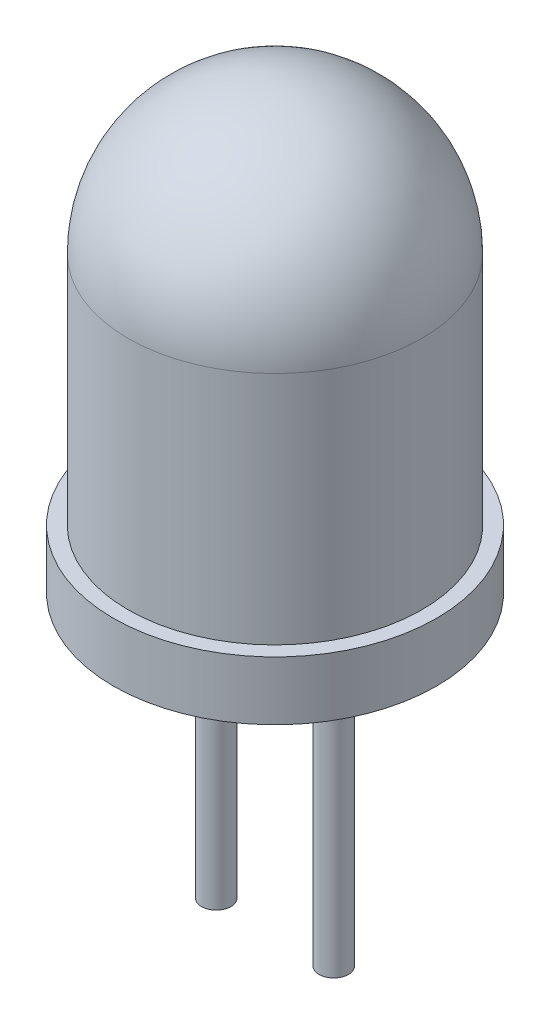
ISO-10303-21;
HEADER;
FILE_DESCRIPTION(('STEP AP214'),'2;1');
FILE_NAME('part.step','',(''),(''),'','','');
FILE_SCHEMA(('AUTOMOTIVE_DESIGN { 1 0 10303 214 1 1 1 1 }'));
ENDSEC;
DATA;
#1=APPLICATION_CONTEXT('core data for automotive mechanical design processes');
#2=APPLICATION_PROTOCOL_DEFINITION('international standard','automotive_design',2000,#1);
#3=PRODUCT_CONTEXT('',#1,'mechanical');
#4=PRODUCT('Part','Part','',(#3));
#5=PRODUCT_RELATED_PRODUCT_CATEGORY('part','',(#4));
#6=PRODUCT_DEFINITION_FORMATION('','',#4);
#7=PRODUCT_DEFINITION_CONTEXT('part definition',#1,'design');
#8=PRODUCT_DEFINITION('design','',#6,#7);
#9=PRODUCT_DEFINITION_SHAPE('','',#8);
#10=(LENGTH_UNIT() NAMED_UNIT(*) SI_UNIT(.MILLI.,.METRE.));
#11=(NAMED_UNIT(*) PLANE_ANGLE_UNIT() SI_UNIT($,.RADIAN.));
#12=(NAMED_UNIT(*) SI_UNIT($,.STERADIAN.) SOLID_ANGLE_UNIT());
#13=UNCERTAINTY_MEASURE_WITH_UNIT(LENGTH_MEASURE(1.E-05),#10,'distance_accuracy_value','');
#14=(GEOMETRIC_REPRESENTATION_CONTEXT(3) GLOBAL_UNCERTAINTY_ASSIGNED_CONTEXT((#13)) GLOBAL_UNIT_ASSIGNED_CONTEXT((#10,
#11,#12)) REPRESENTATION_CONTEXT('',''));
#15=CARTESIAN_POINT('',(0.,0.,0.));
#16=DIRECTION('',(0.,0.,1.));
#17=DIRECTION('',(1.,0.,0.));
#18=AXIS2_PLACEMENT_3D('',#15,#16,#17);
#19=CARTESIAN_POINT('',(0.,0.,0.));
#20=DIRECTION('',(0.,1.,0.));
#21=DIRECTION('',(0.,0.,1.));
#22=AXIS2_PLACEMENT_3D('',#19,#20,#21);
#23=PLANE('',#22);
#24=CARTESIAN_POINT('',(-2.,0.,0.));
#25=DIRECTION('',(0.,1.,0.));
#26=DIRECTION('',(0.,0.,1.));
#27=AXIS2_PLACEMENT_3D('',#24,#25,#26);
#28=CIRCLE('',#27,0.5);
#29=CARTESIAN_POINT('',(-2.,0.,0.5));
#30=VERTEX_POINT('',#29);
#31=EDGE_CURVE('E38',#30,#30,#28,.F.);
#32=ORIENTED_EDGE('',*,*,#31,.F.);
#33=EDGE_LOOP('',(#32));
#34=FACE_BOUND('',#33,.T.);
#35=CARTESIAN_POINT('',(0.,0.,0.));
#36=DIRECTION('',(0.,1.,0.));
#37=DIRECTION('',(0.,0.,1.));
#38=AXIS2_PLACEMENT_3D('',#35,#36,#37);
#39=CIRCLE('',#38,5.5);
#40=CARTESIAN_POINT('',(0.,0.,5.5));
#41=VERTEX_POINT('',#40);
#42=EDGE_CURVE('E46',#41,#41,#39,.T.);
#43=ORIENTED_EDGE('',*,*,#42,.F.);
#44=EDGE_LOOP('',(#43));
#45=FACE_BOUND('',#44,.T.);
#46=CARTESIAN_POINT('',(2.,0.,0.));
#47=DIRECTION('',(0.,1.,0.));
#48=DIRECTION('',(0.,0.,1.));
#49=AXIS2_PLACEMENT_3D('',#46,#47,#48);
#50=CIRCLE('',#49,0.5);
#51=CARTESIAN_POINT('',(2.,0.,0.5));
#52=VERTEX_POINT('',#51);
#53=EDGE_CURVE('E10',#52,#52,#50,.F.);
#54=ORIENTED_EDGE('',*,*,#53,.F.);
#55=EDGE_LOOP('',(#54));
#56=FACE_BOUND('',#55,.T.);
#57=ADVANCED_FACE('F31',(#34,#45,#56),#23,.F.);
#58=CARTESIAN_POINT('',(0.,2.,0.));
#59=DIRECTION('',(0.,1.,0.));
#60=DIRECTION('',(0.,0.,1.));
#61=AXIS2_PLACEMENT_3D('',#58,#59,#60);
#62=PLANE('',#61);
#63=CARTESIAN_POINT('',(0.,2.,0.));
#64=DIRECTION('',(0.,1.,0.));
#65=DIRECTION('',(0.,0.,1.));
#66=AXIS2_PLACEMENT_3D('',#63,#64,#65);
#67=CIRCLE('',#66,5.5);
#68=CARTESIAN_POINT('',(0.,2.,5.5));
#69=VERTEX_POINT('',#68);
#70=EDGE_CURVE('E42',#69,#69,#67,.T.);
#71=ORIENTED_EDGE('',*,*,#70,.T.);
#72=EDGE_LOOP('',(#71));
#73=FACE_BOUND('',#72,.T.);
#74=CARTESIAN_POINT('',(0.,2.,0.));
#75=DIRECTION('',(0.,1.,0.));
#76=DIRECTION('',(0.,0.,1.));
#77=AXIS2_PLACEMENT_3D('',#74,#75,#76);
#78=CIRCLE('',#77,5.);
#79=CARTESIAN_POINT('',(0.,2.,5.));
#80=VERTEX_POINT('',#79);
#81=EDGE_CURVE('E52',#80,#80,#78,.T.);
#82=ORIENTED_EDGE('',*,*,#81,.F.);
#83=EDGE_LOOP('',(#82));
#84=FACE_BOUND('',#83,.T.);
#85=ADVANCED_FACE('F79',(#73,#84),#62,.T.);
#86=CARTESIAN_POINT('',(0.,2.,0.));
#87=DIRECTION('',(0.,-1.,0.));
#88=DIRECTION('',(0.,0.,-1.));
#89=AXIS2_PLACEMENT_3D('',#86,#87,#88);
#90=CYLINDRICAL_SURFACE('',#89,5.5);
#91=ORIENTED_EDGE('',*,*,#70,.F.);
#92=EDGE_LOOP('',(#91));
#93=FACE_BOUND('',#92,.T.);
#94=ORIENTED_EDGE('',*,*,#42,.T.);
#95=EDGE_LOOP('',(#94));
#96=FACE_BOUND('',#95,.T.);
#97=ADVANCED_FACE('F85',(#93,#96),#90,.T.);
#98=CARTESIAN_POINT('',(0.,10.,0.));
#99=DIRECTION('',(0.,-1.,0.));
#100=DIRECTION('',(0.,0.,-1.));
#101=AXIS2_PLACEMENT_3D('',#98,#99,#100);
#102=CYLINDRICAL_SURFACE('',#101,5.);
#103=CARTESIAN_POINT('',(0.,10.,0.));
#104=DIRECTION('',(0.,1.,0.));
#105=DIRECTION('',(0.,0.,1.));
#106=AXIS2_PLACEMENT_3D('',#103,#104,#105);
#107=CIRCLE('',#106,5.);
#108=CARTESIAN_POINT('',(0.,10.,5.));
#109=VERTEX_POINT('',#108);
#110=EDGE_CURVE('E49',#109,#109,#107,.T.);
#111=ORIENTED_EDGE('',*,*,#110,.F.);
#112=EDGE_LOOP('',(#111));
#113=FACE_BOUND('',#112,.T.);
#114=ORIENTED_EDGE('',*,*,#81,.T.);
#115=EDGE_LOOP('',(#114));
#116=FACE_BOUND('',#115,.T.);
#117=ADVANCED_FACE('F91',(#113,#116),#102,.T.);
#118=CARTESIAN_POINT('',(0.,10.,0.));
#119=DIRECTION('',(0.,0.,1.));
#120=DIRECTION('',(1.,0.,0.));
#121=AXIS2_PLACEMENT_3D('',#118,#119,#120);
#122=SPHERICAL_SURFACE('',#121,5.);
#123=CARTESIAN_POINT('',(0.,10.,0.));
#124=DIRECTION('',(0.,1.,0.));
#125=DIRECTION('',(0.,0.,1.));
#126=AXIS2_PLACEMENT_3D('',#123,#124,#125);
#127=SPHERICAL_SURFACE('',#126,5.);
#128=ORIENTED_EDGE('',*,*,#110,.T.);
#129=EDGE_LOOP('',(#128));
#130=FACE_BOUND('',#129,.T.);
#131=ADVANCED_FACE('F33',(#130),#127,.T.);
#132=CARTESIAN_POINT('',(-2.,-10.,0.));
#133=DIRECTION('',(0.,1.,0.));
#134=DIRECTION('',(0.,0.,1.));
#135=AXIS2_PLACEMENT_3D('',#132,#133,#134);
#136=CYLINDRICAL_SURFACE('',#135,0.5);
#137=CARTESIAN_POINT('',(-2.,-10.,0.));
#138=DIRECTION('',(0.,-1.,0.));
#139=DIRECTION('',(0.,0.,-1.));
#140=AXIS2_PLACEMENT_3D('',#137,#138,#139);
#141=CIRCLE('',#140,0.5);
#142=CARTESIAN_POINT('',(-2.,-10.,-0.5));
#143=VERTEX_POINT('',#142);
#144=EDGE_CURVE('E57',#143,#143,#141,.T.);
#145=ORIENTED_EDGE('',*,*,#144,.F.);
#146=EDGE_LOOP('',(#145));
#147=FACE_BOUND('',#146,.T.);
#148=ORIENTED_EDGE('',*,*,#31,.T.);
#149=EDGE_LOOP('',(#148));
#150=FACE_BOUND('',#149,.T.);
#151=ADVANCED_FACE('F75',(#147,#150),#136,.T.);
#152=CARTESIAN_POINT('',(-2.,-10.,0.));
#153=DIRECTION('',(0.,-1.,0.));
#154=DIRECTION('',(0.,0.,-1.));
#155=AXIS2_PLACEMENT_3D('',#152,#153,#154);
#156=PLANE('',#155);
#157=ORIENTED_EDGE('',*,*,#144,.T.);
#158=EDGE_LOOP('',(#157));
#159=FACE_BOUND('',#158,.T.);
#160=ADVANCED_FACE('F68',(#159),#156,.T.);
#161=CARTESIAN_POINT('',(2.,-10.,0.));
#162=DIRECTION('',(0.,1.,0.));
#163=DIRECTION('',(0.,0.,1.));
#164=AXIS2_PLACEMENT_3D('',#161,#162,#163);
#165=CYLINDRICAL_SURFACE('',#164,0.5);
#166=CARTESIAN_POINT('',(2.,-10.,0.));
#167=DIRECTION('',(0.,-1.,0.));
#168=DIRECTION('',(0.,0.,-1.));
#169=AXIS2_PLACEMENT_3D('',#166,#167,#168);
#170=CIRCLE('',#169,0.5);
#171=CARTESIAN_POINT('',(2.,-10.,-0.5));
#172=VERTEX_POINT('',#171);
#173=EDGE_CURVE('E60',#172,#172,#170,.T.);
#174=ORIENTED_EDGE('',*,*,#173,.F.);
#175=EDGE_LOOP('',(#174));
#176=FACE_BOUND('',#175,.T.);
#177=ORIENTED_EDGE('',*,*,#53,.T.);
#178=EDGE_LOOP('',(#177));
#179=FACE_BOUND('',#178,.T.);
#180=ADVANCED_FACE('F66',(#176,#179),#165,.T.);
#181=CARTESIAN_POINT('',(2.,-10.,0.));
#182=DIRECTION('',(0.,-1.,0.));
#183=DIRECTION('',(0.,0.,-1.));
#184=AXIS2_PLACEMENT_3D('',#181,#182,#183);
#185=PLANE('',#184);
#186=ORIENTED_EDGE('',*,*,#173,.T.);
#187=EDGE_LOOP('',(#186));
#188=FACE_BOUND('',#187,.T.);
#189=ADVANCED_FACE('F64',(#188),#185,.T.);
#190=CLOSED_SHELL('',(#57,#85,#97,#117,#131,#151,#160,#180,#189));
#191=MANIFOLD_SOLID_BREP('B2',#190);
#192=ADVANCED_BREP_SHAPE_REPRESENTATION('',(#18,#191),#14);
#193=SHAPE_DEFINITION_REPRESENTATION(#9,#192);
ENDSEC;
END-ISO-10303-21;
